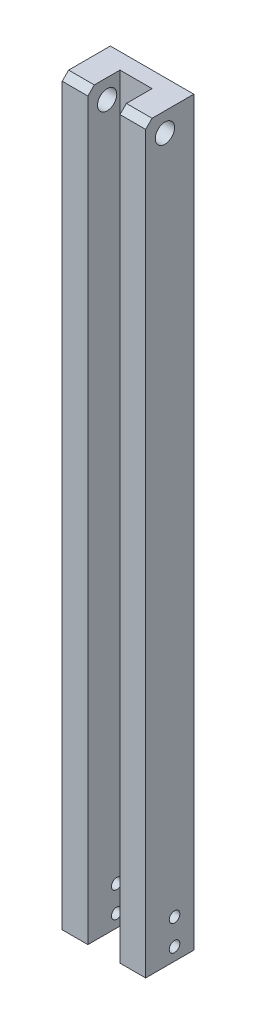
ISO-10303-21;
HEADER;
FILE_DESCRIPTION(('STEP AP214'),'2;1');
FILE_NAME('part.step','',(''),(''),'','','');
FILE_SCHEMA(('AUTOMOTIVE_DESIGN { 1 0 10303 214 1 1 1 1 }'));
ENDSEC;
DATA;
#1=APPLICATION_CONTEXT('core data for automotive mechanical design processes');
#2=APPLICATION_PROTOCOL_DEFINITION('international standard','automotive_design',2000,#1);
#3=PRODUCT_CONTEXT('',#1,'mechanical');
#4=PRODUCT('Part','Part','',(#3));
#5=PRODUCT_RELATED_PRODUCT_CATEGORY('part','',(#4));
#6=PRODUCT_DEFINITION_FORMATION('','',#4);
#7=PRODUCT_DEFINITION_CONTEXT('part definition',#1,'design');
#8=PRODUCT_DEFINITION('design','',#6,#7);
#9=PRODUCT_DEFINITION_SHAPE('','',#8);
#10=(LENGTH_UNIT() NAMED_UNIT(*) SI_UNIT(.MILLI.,.METRE.));
#11=(NAMED_UNIT(*) PLANE_ANGLE_UNIT() SI_UNIT($,.RADIAN.));
#12=(NAMED_UNIT(*) SI_UNIT($,.STERADIAN.) SOLID_ANGLE_UNIT());
#13=UNCERTAINTY_MEASURE_WITH_UNIT(LENGTH_MEASURE(1.E-05),#10,'distance_accuracy_value','');
#14=(GEOMETRIC_REPRESENTATION_CONTEXT(3) GLOBAL_UNCERTAINTY_ASSIGNED_CONTEXT((#13)) GLOBAL_UNIT_ASSIGNED_CONTEXT((#10,
#11,#12)) REPRESENTATION_CONTEXT('',''));
#15=CARTESIAN_POINT('',(0.,0.,0.));
#16=DIRECTION('',(0.,0.,1.));
#17=DIRECTION('',(1.,0.,0.));
#18=AXIS2_PLACEMENT_3D('',#15,#16,#17);
#19=CARTESIAN_POINT('',(0.,-231.,0.));
#20=DIRECTION('',(0.,-1.,0.));
#21=DIRECTION('',(0.,0.,-1.));
#22=AXIS2_PLACEMENT_3D('',#19,#20,#21);
#23=PLANE('',#22);
#24=DIRECTION('',(0.,0.,1.));
#25=VECTOR('',#24,1.);
#26=CARTESIAN_POINT('',(5.,-231.,-2.5));
#27=LINE('',#26,#25);
#28=CARTESIAN_POINT('',(5.,-231.,-7.5));
#29=VERTEX_POINT('',#28);
#30=CARTESIAN_POINT('',(5.,-231.,7.5));
#31=VERTEX_POINT('',#30);
#32=EDGE_CURVE('E216',#29,#31,#27,.T.);
#33=ORIENTED_EDGE('',*,*,#32,.F.);
#34=DIRECTION('',(-1.,0.,0.));
#35=VECTOR('',#34,1.);
#36=CARTESIAN_POINT('',(-13.,-231.,-7.5));
#37=LINE('',#36,#35);
#38=CARTESIAN_POINT('',(13.,-231.,-7.5));
#39=VERTEX_POINT('',#38);
#40=EDGE_CURVE('E226',#39,#29,#37,.T.);
#41=ORIENTED_EDGE('',*,*,#40,.F.);
#42=DIRECTION('',(0.,0.,-1.));
#43=VECTOR('',#42,1.);
#44=CARTESIAN_POINT('',(13.,-231.,7.5));
#45=LINE('',#44,#43);
#46=CARTESIAN_POINT('',(13.,-231.,7.5));
#47=VERTEX_POINT('',#46);
#48=EDGE_CURVE('E190',#47,#39,#45,.T.);
#49=ORIENTED_EDGE('',*,*,#48,.F.);
#50=DIRECTION('',(1.,0.,0.));
#51=VECTOR('',#50,1.);
#52=CARTESIAN_POINT('',(5.,-231.,7.5));
#53=LINE('',#52,#51);
#54=EDGE_CURVE('E167',#31,#47,#53,.T.);
#55=ORIENTED_EDGE('',*,*,#54,.F.);
#56=EDGE_LOOP('',(#33,#41,#49,#55));
#57=FACE_BOUND('',#56,.T.);
#58=ADVANCED_FACE('F37',(#57),#23,.T.);
#59=CARTESIAN_POINT('',(-13.,-219.,-1.5));
#60=DIRECTION('',(-1.,0.,0.));
#61=DIRECTION('',(0.,0.,1.));
#62=AXIS2_PLACEMENT_3D('',#59,#60,#61);
#63=CYLINDRICAL_SURFACE('',#62,1.65);
#64=CARTESIAN_POINT('',(13.,-219.,-1.5));
#65=DIRECTION('',(-1.,0.,0.));
#66=DIRECTION('',(0.,0.,1.));
#67=AXIS2_PLACEMENT_3D('',#64,#65,#66);
#68=CIRCLE('',#67,1.64999999999998);
#69=CARTESIAN_POINT('',(13.,-219.,0.149999999999987));
#70=VERTEX_POINT('',#69);
#71=EDGE_CURVE('E248',#70,#70,#68,.T.);
#72=ORIENTED_EDGE('',*,*,#71,.F.);
#73=EDGE_LOOP('',(#72));
#74=FACE_BOUND('',#73,.T.);
#75=CARTESIAN_POINT('',(5.,-219.,-1.5));
#76=DIRECTION('',(-1.,0.,0.));
#77=DIRECTION('',(0.,0.,1.));
#78=AXIS2_PLACEMENT_3D('',#75,#76,#77);
#79=CIRCLE('',#78,1.65);
#80=CARTESIAN_POINT('',(5.,-219.,0.150000000000001));
#81=VERTEX_POINT('',#80);
#82=EDGE_CURVE('E240',#81,#81,#79,.T.);
#83=ORIENTED_EDGE('',*,*,#82,.T.);
#84=EDGE_LOOP('',(#83));
#85=FACE_BOUND('',#84,.T.);
#86=ADVANCED_FACE('F290',(#74,#85),#63,.F.);
#87=CARTESIAN_POINT('',(-13.,-227.,-1.5));
#88=DIRECTION('',(-1.,0.,0.));
#89=DIRECTION('',(0.,0.,1.));
#90=AXIS2_PLACEMENT_3D('',#87,#88,#89);
#91=CYLINDRICAL_SURFACE('',#90,1.65);
#92=CARTESIAN_POINT('',(13.,-227.,-1.5));
#93=DIRECTION('',(-1.,0.,0.));
#94=DIRECTION('',(0.,0.,1.));
#95=AXIS2_PLACEMENT_3D('',#92,#93,#94);
#96=CIRCLE('',#95,1.64999999999998);
#97=CARTESIAN_POINT('',(13.,-227.,0.149999999999987));
#98=VERTEX_POINT('',#97);
#99=EDGE_CURVE('E260',#98,#98,#96,.T.);
#100=ORIENTED_EDGE('',*,*,#99,.F.);
#101=EDGE_LOOP('',(#100));
#102=FACE_BOUND('',#101,.T.);
#103=CARTESIAN_POINT('',(5.,-227.,-1.5));
#104=DIRECTION('',(-1.,0.,0.));
#105=DIRECTION('',(0.,0.,1.));
#106=AXIS2_PLACEMENT_3D('',#103,#104,#105);
#107=CIRCLE('',#106,1.65);
#108=CARTESIAN_POINT('',(5.,-227.,0.150000000000001));
#109=VERTEX_POINT('',#108);
#110=EDGE_CURVE('E254',#109,#109,#107,.T.);
#111=ORIENTED_EDGE('',*,*,#110,.T.);
#112=EDGE_LOOP('',(#111));
#113=FACE_BOUND('',#112,.T.);
#114=ADVANCED_FACE('F295',(#102,#113),#91,.F.);
#115=CARTESIAN_POINT('',(-5.,-231.,-2.5));
#116=DIRECTION('',(0.,0.,1.));
#117=DIRECTION('',(1.,0.,0.));
#118=AXIS2_PLACEMENT_3D('',#115,#116,#117);
#119=PLANE('',#118);
#120=DIRECTION('',(-1.,0.,0.));
#121=VECTOR('',#120,1.);
#122=CARTESIAN_POINT('',(-5.,-67.45,-2.5));
#123=LINE('',#122,#121);
#124=CARTESIAN_POINT('',(5.,-67.45,-2.5));
#125=VERTEX_POINT('',#124);
#126=CARTESIAN_POINT('',(-5.,-67.45,-2.5));
#127=VERTEX_POINT('',#126);
#128=EDGE_CURVE('E127',#125,#127,#123,.T.);
#129=ORIENTED_EDGE('',*,*,#128,.F.);
#130=DIRECTION('',(0.,1.,0.));
#131=VECTOR('',#130,1.);
#132=CARTESIAN_POINT('',(5.,-231.,-2.5));
#133=LINE('',#132,#131);
#134=CARTESIAN_POINT('',(5.,0.,-2.5));
#135=VERTEX_POINT('',#134);
#136=EDGE_CURVE('E140',#125,#135,#133,.T.);
#137=ORIENTED_EDGE('',*,*,#136,.T.);
#138=DIRECTION('',(1.,0.,0.));
#139=VECTOR('',#138,1.);
#140=CARTESIAN_POINT('',(-5.,0.,-2.5));
#141=LINE('',#140,#139);
#142=CARTESIAN_POINT('',(-5.,0.,-2.5));
#143=VERTEX_POINT('',#142);
#144=EDGE_CURVE('E189',#143,#135,#141,.T.);
#145=ORIENTED_EDGE('',*,*,#144,.F.);
#146=DIRECTION('',(0.,1.,0.));
#147=VECTOR('',#146,1.);
#148=CARTESIAN_POINT('',(-5.,-231.,-2.5));
#149=LINE('',#148,#147);
#150=EDGE_CURVE('E142',#127,#143,#149,.T.);
#151=ORIENTED_EDGE('',*,*,#150,.F.);
#152=EDGE_LOOP('',(#129,#137,#145,#151));
#153=FACE_BOUND('',#152,.T.);
#154=ADVANCED_FACE('F138',(#153),#119,.T.);
#155=CARTESIAN_POINT('',(13.,-231.,7.5));
#156=DIRECTION('',(1.,0.,0.));
#157=DIRECTION('',(0.,0.,-1.));
#158=AXIS2_PLACEMENT_3D('',#155,#156,#157);
#159=PLANE('',#158);
#160=ORIENTED_EDGE('',*,*,#99,.T.);
#161=EDGE_LOOP('',(#160));
#162=FACE_BOUND('',#161,.T.);
#163=ORIENTED_EDGE('',*,*,#71,.T.);
#164=EDGE_LOOP('',(#163));
#165=FACE_BOUND('',#164,.T.);
#166=CARTESIAN_POINT('',(13.,-6.00000000000001,1.5));
#167=DIRECTION('',(1.,0.,0.));
#168=DIRECTION('',(0.,0.,-1.));
#169=AXIS2_PLACEMENT_3D('',#166,#167,#168);
#170=CIRCLE('',#169,3.);
#171=CARTESIAN_POINT('',(13.,-6.00000000000001,-1.5));
#172=VERTEX_POINT('',#171);
#173=EDGE_CURVE('E237',#172,#172,#170,.T.);
#174=ORIENTED_EDGE('',*,*,#173,.F.);
#175=EDGE_LOOP('',(#174));
#176=FACE_BOUND('',#175,.T.);
#177=DIRECTION('',(0.,0.,-1.));
#178=VECTOR('',#177,1.);
#179=CARTESIAN_POINT('',(13.,0.,7.5));
#180=LINE('',#179,#178);
#181=CARTESIAN_POINT('',(13.,0.,5.50000000000002));
#182=VERTEX_POINT('',#181);
#183=CARTESIAN_POINT('',(13.,0.,-7.5));
#184=VERTEX_POINT('',#183);
#185=EDGE_CURVE('E198',#182,#184,#180,.T.);
#186=ORIENTED_EDGE('',*,*,#185,.F.);
#187=DIRECTION('',(0.,-0.707106781186548,0.707106781186548));
#188=VECTOR('',#187,1.);
#189=CARTESIAN_POINT('',(13.,-116.5,122.));
#190=LINE('',#189,#188);
#191=CARTESIAN_POINT('',(13.,-2.,7.5));
#192=VERTEX_POINT('',#191);
#193=EDGE_CURVE('E174',#182,#192,#190,.T.);
#194=ORIENTED_EDGE('',*,*,#193,.T.);
#195=DIRECTION('',(0.,1.,0.));
#196=VECTOR('',#195,1.);
#197=CARTESIAN_POINT('',(13.,-231.,7.5));
#198=LINE('',#197,#196);
#199=EDGE_CURVE('E153',#47,#192,#198,.T.);
#200=ORIENTED_EDGE('',*,*,#199,.F.);
#201=ORIENTED_EDGE('',*,*,#48,.T.);
#202=DIRECTION('',(0.,1.,0.));
#203=VECTOR('',#202,1.);
#204=CARTESIAN_POINT('',(13.,-231.,-7.5));
#205=LINE('',#204,#203);
#206=EDGE_CURVE('E164',#39,#184,#205,.T.);
#207=ORIENTED_EDGE('',*,*,#206,.T.);
#208=EDGE_LOOP('',(#186,#194,#200,#201,#207));
#209=FACE_BOUND('',#208,.T.);
#210=ADVANCED_FACE('F195',(#162,#165,#176,#209),#159,.T.);
#211=CARTESIAN_POINT('',(5.,-231.,7.5));
#212=DIRECTION('',(0.,0.,1.));
#213=DIRECTION('',(1.,0.,0.));
#214=AXIS2_PLACEMENT_3D('',#211,#212,#213);
#215=PLANE('',#214);
#216=ORIENTED_EDGE('',*,*,#199,.T.);
#217=DIRECTION('',(-1.,0.,0.));
#218=VECTOR('',#217,1.);
#219=CARTESIAN_POINT('',(5.,-2.,7.5));
#220=LINE('',#219,#218);
#221=CARTESIAN_POINT('',(5.,-2.00000000000002,7.50000000000002));
#222=VERTEX_POINT('',#221);
#223=EDGE_CURVE('E176',#192,#222,#220,.T.);
#224=ORIENTED_EDGE('',*,*,#223,.T.);
#225=DIRECTION('',(0.,1.,0.));
#226=VECTOR('',#225,1.);
#227=CARTESIAN_POINT('',(5.,-231.,7.5));
#228=LINE('',#227,#226);
#229=EDGE_CURVE('E150',#31,#222,#228,.T.);
#230=ORIENTED_EDGE('',*,*,#229,.F.);
#231=ORIENTED_EDGE('',*,*,#54,.T.);
#232=EDGE_LOOP('',(#216,#224,#230,#231));
#233=FACE_BOUND('',#232,.T.);
#234=ADVANCED_FACE('F201',(#233),#215,.T.);
#235=CARTESIAN_POINT('',(5.,-231.,-2.5));
#236=DIRECTION('',(-1.,0.,0.));
#237=DIRECTION('',(0.,0.,1.));
#238=AXIS2_PLACEMENT_3D('',#235,#236,#237);
#239=PLANE('',#238);
#240=ORIENTED_EDGE('',*,*,#82,.F.);
#241=EDGE_LOOP('',(#240));
#242=FACE_BOUND('',#241,.T.);
#243=ORIENTED_EDGE('',*,*,#136,.F.);
#244=DIRECTION('',(0.,0.,1.));
#245=VECTOR('',#244,1.);
#246=CARTESIAN_POINT('',(5.,-67.45,-7.501));
#247=LINE('',#246,#245);
#248=CARTESIAN_POINT('',(5.,-67.45,-7.5));
#249=VERTEX_POINT('',#248);
#250=EDGE_CURVE('E124',#249,#125,#247,.T.);
#251=ORIENTED_EDGE('',*,*,#250,.F.);
#252=DIRECTION('',(0.,1.,0.));
#253=VECTOR('',#252,1.);
#254=CARTESIAN_POINT('',(5.,-235.452742078331,-7.5));
#255=LINE('',#254,#253);
#256=EDGE_CURVE('E143',#29,#249,#255,.T.);
#257=ORIENTED_EDGE('',*,*,#256,.F.);
#258=ORIENTED_EDGE('',*,*,#32,.T.);
#259=ORIENTED_EDGE('',*,*,#229,.T.);
#260=DIRECTION('',(0.,0.707106781186548,-0.707106781186548));
#261=VECTOR('',#260,1.);
#262=CARTESIAN_POINT('',(5.00000000000001,-111.5,117.));
#263=LINE('',#262,#261);
#264=CARTESIAN_POINT('',(5.,0.,5.50000000000003));
#265=VERTEX_POINT('',#264);
#266=EDGE_CURVE('E178',#222,#265,#263,.T.);
#267=ORIENTED_EDGE('',*,*,#266,.T.);
#268=DIRECTION('',(0.,0.,1.));
#269=VECTOR('',#268,1.);
#270=CARTESIAN_POINT('',(5.,0.,-2.5));
#271=LINE('',#270,#269);
#272=EDGE_CURVE('E148',#135,#265,#271,.T.);
#273=ORIENTED_EDGE('',*,*,#272,.F.);
#274=EDGE_LOOP('',(#243,#251,#257,#258,#259,#267,#273));
#275=FACE_BOUND('',#274,.T.);
#276=ORIENTED_EDGE('',*,*,#110,.F.);
#277=EDGE_LOOP('',(#276));
#278=FACE_BOUND('',#277,.T.);
#279=CARTESIAN_POINT('',(5.,-6.00000000000001,1.5));
#280=DIRECTION('',(-1.,0.,0.));
#281=DIRECTION('',(0.,0.,1.));
#282=AXIS2_PLACEMENT_3D('',#279,#280,#281);
#283=CIRCLE('',#282,3.);
#284=CARTESIAN_POINT('',(4.99999999999999,-6.00000000000001,-1.5));
#285=VERTEX_POINT('',#284);
#286=EDGE_CURVE('E214',#285,#285,#283,.T.);
#287=ORIENTED_EDGE('',*,*,#286,.F.);
#288=EDGE_LOOP('',(#287));
#289=FACE_BOUND('',#288,.T.);
#290=ADVANCED_FACE('F145',(#242,#275,#278,#289),#239,.T.);
#291=CARTESIAN_POINT('',(-5.,-231.,-2.5));
#292=DIRECTION('',(1.,0.,0.));
#293=DIRECTION('',(0.,0.,-1.));
#294=AXIS2_PLACEMENT_3D('',#291,#292,#293);
#295=PLANE('',#294);
#296=CARTESIAN_POINT('',(-5.,-219.,-1.5));
#297=DIRECTION('',(1.,0.,0.));
#298=DIRECTION('',(0.,0.,-1.));
#299=AXIS2_PLACEMENT_3D('',#296,#297,#298);
#300=CIRCLE('',#299,1.65);
#301=CARTESIAN_POINT('',(-5.,-219.,-3.15));
#302=VERTEX_POINT('',#301);
#303=EDGE_CURVE('E245',#302,#302,#300,.T.);
#304=ORIENTED_EDGE('',*,*,#303,.F.);
#305=EDGE_LOOP('',(#304));
#306=FACE_BOUND('',#305,.T.);
#307=DIRECTION('',(0.,0.,1.));
#308=VECTOR('',#307,1.);
#309=CARTESIAN_POINT('',(-5.,-67.45,-7.501));
#310=LINE('',#309,#308);
#311=CARTESIAN_POINT('',(-5.,-67.45,-7.5));
#312=VERTEX_POINT('',#311);
#313=EDGE_CURVE('E135',#312,#127,#310,.T.);
#314=ORIENTED_EDGE('',*,*,#313,.T.);
#315=ORIENTED_EDGE('',*,*,#150,.T.);
#316=DIRECTION('',(0.,0.,-1.));
#317=VECTOR('',#316,1.);
#318=CARTESIAN_POINT('',(-5.,0.,-2.5));
#319=LINE('',#318,#317);
#320=CARTESIAN_POINT('',(-5.,0.,5.50000000000003));
#321=VERTEX_POINT('',#320);
#322=EDGE_CURVE('E205',#321,#143,#319,.T.);
#323=ORIENTED_EDGE('',*,*,#322,.F.);
#324=DIRECTION('',(0.,-0.707106781186548,0.707106781186548));
#325=VECTOR('',#324,1.);
#326=CARTESIAN_POINT('',(-5.,-111.5,117.));
#327=LINE('',#326,#325);
#328=CARTESIAN_POINT('',(-5.,-2.,7.5));
#329=VERTEX_POINT('',#328);
#330=EDGE_CURVE('E59',#321,#329,#327,.T.);
#331=ORIENTED_EDGE('',*,*,#330,.T.);
#332=DIRECTION('',(0.,1.,0.));
#333=VECTOR('',#332,1.);
#334=CARTESIAN_POINT('',(-5.,-231.,7.5));
#335=LINE('',#334,#333);
#336=CARTESIAN_POINT('',(-5.,-231.,7.5));
#337=VERTEX_POINT('',#336);
#338=EDGE_CURVE('E155',#337,#329,#335,.T.);
#339=ORIENTED_EDGE('',*,*,#338,.F.);
#340=DIRECTION('',(0.,0.,-1.));
#341=VECTOR('',#340,1.);
#342=CARTESIAN_POINT('',(-5.,-231.,-2.5));
#343=LINE('',#342,#341);
#344=CARTESIAN_POINT('',(-5.,-231.,-7.5));
#345=VERTEX_POINT('',#344);
#346=EDGE_CURVE('E218',#337,#345,#343,.T.);
#347=ORIENTED_EDGE('',*,*,#346,.T.);
#348=DIRECTION('',(0.,-1.,0.));
#349=VECTOR('',#348,1.);
#350=CARTESIAN_POINT('',(-5.,-235.452742078331,-7.5));
#351=LINE('',#350,#349);
#352=EDGE_CURVE('E269',#312,#345,#351,.T.);
#353=ORIENTED_EDGE('',*,*,#352,.F.);
#354=EDGE_LOOP('',(#314,#315,#323,#331,#339,#347,#353));
#355=FACE_BOUND('',#354,.T.);
#356=CARTESIAN_POINT('',(-5.,-227.,-1.5));
#357=DIRECTION('',(1.,0.,0.));
#358=DIRECTION('',(0.,0.,-1.));
#359=AXIS2_PLACEMENT_3D('',#356,#357,#358);
#360=CIRCLE('',#359,1.65);
#361=CARTESIAN_POINT('',(-5.,-227.,-3.15));
#362=VERTEX_POINT('',#361);
#363=EDGE_CURVE('E257',#362,#362,#360,.T.);
#364=ORIENTED_EDGE('',*,*,#363,.F.);
#365=EDGE_LOOP('',(#364));
#366=FACE_BOUND('',#365,.T.);
#367=CARTESIAN_POINT('',(-5.,-6.00000000000001,1.5));
#368=DIRECTION('',(1.,0.,0.));
#369=DIRECTION('',(0.,0.,-1.));
#370=AXIS2_PLACEMENT_3D('',#367,#368,#369);
#371=CIRCLE('',#370,3.);
#372=CARTESIAN_POINT('',(-5.,-6.00000000000001,-1.5));
#373=VERTEX_POINT('',#372);
#374=EDGE_CURVE('E233',#373,#373,#371,.T.);
#375=ORIENTED_EDGE('',*,*,#374,.F.);
#376=EDGE_LOOP('',(#375));
#377=FACE_BOUND('',#376,.T.);
#378=ADVANCED_FACE('F345',(#306,#355,#366,#377),#295,.T.);
#379=CARTESIAN_POINT('',(-13.,-231.,7.5));
#380=DIRECTION('',(0.,0.,1.));
#381=DIRECTION('',(1.,0.,0.));
#382=AXIS2_PLACEMENT_3D('',#379,#380,#381);
#383=PLANE('',#382);
#384=ORIENTED_EDGE('',*,*,#338,.T.);
#385=DIRECTION('',(-1.,0.,0.));
#386=VECTOR('',#385,1.);
#387=CARTESIAN_POINT('',(-13.,-2.,7.5));
#388=LINE('',#387,#386);
#389=CARTESIAN_POINT('',(-13.,-2.,7.5));
#390=VERTEX_POINT('',#389);
#391=EDGE_CURVE('E45',#329,#390,#388,.T.);
#392=ORIENTED_EDGE('',*,*,#391,.T.);
#393=DIRECTION('',(0.,1.,0.));
#394=VECTOR('',#393,1.);
#395=CARTESIAN_POINT('',(-13.,-231.,7.5));
#396=LINE('',#395,#394);
#397=CARTESIAN_POINT('',(-13.,-231.,7.5));
#398=VERTEX_POINT('',#397);
#399=EDGE_CURVE('E160',#398,#390,#396,.T.);
#400=ORIENTED_EDGE('',*,*,#399,.F.);
#401=DIRECTION('',(1.,0.,0.));
#402=VECTOR('',#401,1.);
#403=CARTESIAN_POINT('',(-13.,-231.,7.5));
#404=LINE('',#403,#402);
#405=EDGE_CURVE('E220',#398,#337,#404,.T.);
#406=ORIENTED_EDGE('',*,*,#405,.T.);
#407=EDGE_LOOP('',(#384,#392,#400,#406));
#408=FACE_BOUND('',#407,.T.);
#409=ADVANCED_FACE('F311',(#408),#383,.T.);
#410=CARTESIAN_POINT('',(-13.,-231.,7.5));
#411=DIRECTION('',(-1.,0.,0.));
#412=DIRECTION('',(0.,0.,1.));
#413=AXIS2_PLACEMENT_3D('',#410,#411,#412);
#414=PLANE('',#413);
#415=CARTESIAN_POINT('',(-13.,-227.,-1.5));
#416=DIRECTION('',(-1.,0.,0.));
#417=DIRECTION('',(0.,0.,1.));
#418=AXIS2_PLACEMENT_3D('',#415,#416,#417);
#419=CIRCLE('',#418,1.65000000000001);
#420=CARTESIAN_POINT('',(-13.,-227.,0.150000000000015));
#421=VERTEX_POINT('',#420);
#422=EDGE_CURVE('E263',#421,#421,#419,.T.);
#423=ORIENTED_EDGE('',*,*,#422,.F.);
#424=EDGE_LOOP('',(#423));
#425=FACE_BOUND('',#424,.T.);
#426=CARTESIAN_POINT('',(-13.,-219.,-1.5));
#427=DIRECTION('',(-1.,0.,0.));
#428=DIRECTION('',(0.,0.,1.));
#429=AXIS2_PLACEMENT_3D('',#426,#427,#428);
#430=CIRCLE('',#429,1.65000000000001);
#431=CARTESIAN_POINT('',(-13.,-219.,0.150000000000015));
#432=VERTEX_POINT('',#431);
#433=EDGE_CURVE('E251',#432,#432,#430,.T.);
#434=ORIENTED_EDGE('',*,*,#433,.F.);
#435=EDGE_LOOP('',(#434));
#436=FACE_BOUND('',#435,.T.);
#437=CARTESIAN_POINT('',(-13.,-6.00000000000001,1.5));
#438=DIRECTION('',(1.,0.,0.));
#439=DIRECTION('',(0.,0.,-1.));
#440=AXIS2_PLACEMENT_3D('',#437,#438,#439);
#441=CIRCLE('',#440,3.);
#442=CARTESIAN_POINT('',(-13.,-6.00000000000001,-1.5));
#443=VERTEX_POINT('',#442);
#444=EDGE_CURVE('E236',#443,#443,#441,.T.);
#445=ORIENTED_EDGE('',*,*,#444,.T.);
#446=EDGE_LOOP('',(#445));
#447=FACE_BOUND('',#446,.T.);
#448=ORIENTED_EDGE('',*,*,#399,.T.);
#449=DIRECTION('',(0.,0.707106781186548,-0.707106781186548));
#450=VECTOR('',#449,1.);
#451=CARTESIAN_POINT('',(-13.,-116.5,122.));
#452=LINE('',#451,#450);
#453=CARTESIAN_POINT('',(-13.,0.,5.50000000000002));
#454=VERTEX_POINT('',#453);
#455=EDGE_CURVE('E11',#390,#454,#452,.T.);
#456=ORIENTED_EDGE('',*,*,#455,.T.);
#457=DIRECTION('',(0.,0.,1.));
#458=VECTOR('',#457,1.);
#459=CARTESIAN_POINT('',(-13.,0.,7.5));
#460=LINE('',#459,#458);
#461=CARTESIAN_POINT('',(-13.,0.,-7.5));
#462=VERTEX_POINT('',#461);
#463=EDGE_CURVE('E207',#462,#454,#460,.T.);
#464=ORIENTED_EDGE('',*,*,#463,.F.);
#465=DIRECTION('',(0.,1.,0.));
#466=VECTOR('',#465,1.);
#467=CARTESIAN_POINT('',(-13.,-231.,-7.5));
#468=LINE('',#467,#466);
#469=CARTESIAN_POINT('',(-13.,-231.,-7.5));
#470=VERTEX_POINT('',#469);
#471=EDGE_CURVE('E162',#470,#462,#468,.T.);
#472=ORIENTED_EDGE('',*,*,#471,.F.);
#473=DIRECTION('',(0.,0.,1.));
#474=VECTOR('',#473,1.);
#475=CARTESIAN_POINT('',(-13.,-231.,7.5));
#476=LINE('',#475,#474);
#477=EDGE_CURVE('E223',#470,#398,#476,.T.);
#478=ORIENTED_EDGE('',*,*,#477,.T.);
#479=EDGE_LOOP('',(#448,#456,#464,#472,#478));
#480=FACE_BOUND('',#479,.T.);
#481=ADVANCED_FACE('F282',(#425,#436,#447,#480),#414,.T.);
#482=CARTESIAN_POINT('',(-13.,-231.,-7.5));
#483=DIRECTION('',(0.,0.,-1.));
#484=DIRECTION('',(-1.,0.,0.));
#485=AXIS2_PLACEMENT_3D('',#482,#483,#484);
#486=PLANE('',#485);
#487=ORIENTED_EDGE('',*,*,#256,.T.);
#488=DIRECTION('',(-1.,0.,0.));
#489=VECTOR('',#488,1.);
#490=CARTESIAN_POINT('',(-5.,-67.45,-7.5));
#491=LINE('',#490,#489);
#492=EDGE_CURVE('E130',#249,#312,#491,.T.);
#493=ORIENTED_EDGE('',*,*,#492,.T.);
#494=ORIENTED_EDGE('',*,*,#352,.T.);
#495=EDGE_CURVE('E229',#345,#470,#37,.T.);
#496=ORIENTED_EDGE('',*,*,#495,.T.);
#497=ORIENTED_EDGE('',*,*,#471,.T.);
#498=DIRECTION('',(-1.,0.,0.));
#499=VECTOR('',#498,1.);
#500=CARTESIAN_POINT('',(-13.,0.,-7.5));
#501=LINE('',#500,#499);
#502=EDGE_CURVE('E210',#184,#462,#501,.T.);
#503=ORIENTED_EDGE('',*,*,#502,.F.);
#504=ORIENTED_EDGE('',*,*,#206,.F.);
#505=ORIENTED_EDGE('',*,*,#40,.T.);
#506=EDGE_LOOP('',(#487,#493,#494,#496,#497,#503,#504,#505));
#507=FACE_BOUND('',#506,.T.);
#508=ADVANCED_FACE('F274',(#507),#486,.T.);
#509=ORIENTED_EDGE('',*,*,#495,.F.);
#510=ORIENTED_EDGE('',*,*,#346,.F.);
#511=ORIENTED_EDGE('',*,*,#405,.F.);
#512=ORIENTED_EDGE('',*,*,#477,.F.);
#513=EDGE_LOOP('',(#509,#510,#511,#512));
#514=FACE_BOUND('',#513,.T.);
#515=ADVANCED_FACE('F279',(#514),#23,.T.);
#516=CARTESIAN_POINT('',(0.,0.,0.));
#517=DIRECTION('',(0.,-1.,0.));
#518=DIRECTION('',(0.,0.,-1.));
#519=AXIS2_PLACEMENT_3D('',#516,#517,#518);
#520=PLANE('',#519);
#521=ORIENTED_EDGE('',*,*,#272,.T.);
#522=DIRECTION('',(1.,0.,0.));
#523=VECTOR('',#522,1.);
#524=CARTESIAN_POINT('',(13.,0.,5.5));
#525=LINE('',#524,#523);
#526=EDGE_CURVE('E171',#265,#182,#525,.T.);
#527=ORIENTED_EDGE('',*,*,#526,.T.);
#528=ORIENTED_EDGE('',*,*,#185,.T.);
#529=ORIENTED_EDGE('',*,*,#502,.T.);
#530=ORIENTED_EDGE('',*,*,#463,.T.);
#531=DIRECTION('',(1.,0.,0.));
#532=VECTOR('',#531,1.);
#533=CARTESIAN_POINT('',(-5.,0.,5.5));
#534=LINE('',#533,#532);
#535=EDGE_CURVE('E168',#454,#321,#534,.T.);
#536=ORIENTED_EDGE('',*,*,#535,.T.);
#537=ORIENTED_EDGE('',*,*,#322,.T.);
#538=ORIENTED_EDGE('',*,*,#144,.T.);
#539=EDGE_LOOP('',(#521,#527,#528,#529,#530,#536,#537,#538));
#540=FACE_BOUND('',#539,.T.);
#541=ADVANCED_FACE('F186',(#540),#520,.F.);
#542=CARTESIAN_POINT('',(-13.,-6.00000000000001,1.5));
#543=DIRECTION('',(1.,0.,0.));
#544=DIRECTION('',(0.,0.,-1.));
#545=AXIS2_PLACEMENT_3D('',#542,#543,#544);
#546=CYLINDRICAL_SURFACE('',#545,3.);
#547=CARTESIAN_POINT('',(-5.,-6.00000000000001,-1.5));
#548=CARTESIAN_POINT('',(-5.08333333333334,-6.00000000000001,-1.5));
#549=CARTESIAN_POINT('',(-5.16666666666667,-6.00000000000001,-1.5));
#550=CARTESIAN_POINT('',(-5.33333333333334,-6.00000000000001,-1.5));
#551=CARTESIAN_POINT('',(-5.41666666666667,-6.00000000000001,-1.5));
#552=CARTESIAN_POINT('',(-5.58333333333334,-6.00000000000001,-1.5));
#553=CARTESIAN_POINT('',(-5.66666666666667,-6.00000000000001,-1.5));
#554=CARTESIAN_POINT('',(-5.83333333333334,-6.00000000000001,-1.5));
#555=CARTESIAN_POINT('',(-5.91666666666667,-6.00000000000001,-1.5));
#556=CARTESIAN_POINT('',(-6.08333333333334,-6.00000000000001,-1.5));
#557=CARTESIAN_POINT('',(-6.16666666666667,-6.00000000000001,-1.5));
#558=CARTESIAN_POINT('',(-6.33333333333334,-6.00000000000001,-1.5));
#559=CARTESIAN_POINT('',(-6.41666666666667,-6.00000000000001,-1.5));
#560=CARTESIAN_POINT('',(-6.58333333333334,-6.00000000000001,-1.5));
#561=CARTESIAN_POINT('',(-6.66666666666667,-6.00000000000001,-1.5));
#562=CARTESIAN_POINT('',(-6.83333333333334,-6.00000000000001,-1.5));
#563=CARTESIAN_POINT('',(-6.91666666666667,-6.00000000000001,-1.5));
#564=CARTESIAN_POINT('',(-7.08333333333334,-6.00000000000001,-1.5));
#565=CARTESIAN_POINT('',(-7.16666666666667,-6.00000000000001,-1.5));
#566=CARTESIAN_POINT('',(-7.33333333333334,-6.00000000000001,-1.5));
#567=CARTESIAN_POINT('',(-7.41666666666667,-6.00000000000001,-1.5));
#568=CARTESIAN_POINT('',(-7.58333333333334,-6.00000000000001,-1.5));
#569=CARTESIAN_POINT('',(-7.66666666666667,-6.00000000000001,-1.5));
#570=CARTESIAN_POINT('',(-7.83333333333334,-6.00000000000001,-1.5));
#571=CARTESIAN_POINT('',(-7.91666666666667,-6.00000000000001,-1.5));
#572=CARTESIAN_POINT('',(-8.08333333333334,-6.00000000000001,-1.5));
#573=CARTESIAN_POINT('',(-8.16666666666667,-6.00000000000001,-1.5));
#574=CARTESIAN_POINT('',(-8.33333333333334,-6.00000000000001,-1.5));
#575=CARTESIAN_POINT('',(-8.41666666666667,-6.00000000000001,-1.5));
#576=CARTESIAN_POINT('',(-8.58333333333334,-6.00000000000001,-1.5));
#577=CARTESIAN_POINT('',(-8.66666666666667,-6.00000000000001,-1.5));
#578=CARTESIAN_POINT('',(-8.83333333333334,-6.00000000000001,-1.5));
#579=CARTESIAN_POINT('',(-8.91666666666667,-6.00000000000001,-1.5));
#580=CARTESIAN_POINT('',(-9.08333333333334,-6.00000000000001,-1.5));
#581=CARTESIAN_POINT('',(-9.16666666666667,-6.00000000000001,-1.5));
#582=CARTESIAN_POINT('',(-9.33333333333334,-6.00000000000001,-1.5));
#583=CARTESIAN_POINT('',(-9.41666666666667,-6.00000000000001,-1.5));
#584=CARTESIAN_POINT('',(-9.58333333333334,-6.00000000000001,-1.5));
#585=CARTESIAN_POINT('',(-9.66666666666667,-6.00000000000001,-1.5));
#586=CARTESIAN_POINT('',(-9.83333333333334,-6.00000000000001,-1.5));
#587=CARTESIAN_POINT('',(-9.91666666666667,-6.00000000000001,-1.5));
#588=CARTESIAN_POINT('',(-10.0833333333333,-6.00000000000001,-1.5));
#589=CARTESIAN_POINT('',(-10.1666666666667,-6.00000000000001,-1.5));
#590=CARTESIAN_POINT('',(-10.3333333333333,-6.00000000000001,-1.5));
#591=CARTESIAN_POINT('',(-10.4166666666667,-6.00000000000001,-1.5));
#592=CARTESIAN_POINT('',(-10.5833333333333,-6.00000000000001,-1.5));
#593=CARTESIAN_POINT('',(-10.6666666666667,-6.00000000000001,-1.5));
#594=CARTESIAN_POINT('',(-10.8333333333333,-6.00000000000001,-1.5));
#595=CARTESIAN_POINT('',(-10.9166666666667,-6.00000000000001,-1.5));
#596=CARTESIAN_POINT('',(-11.0833333333333,-6.00000000000001,-1.5));
#597=CARTESIAN_POINT('',(-11.1666666666667,-6.00000000000001,-1.5));
#598=CARTESIAN_POINT('',(-11.3333333333333,-6.00000000000001,-1.5));
#599=CARTESIAN_POINT('',(-11.4166666666667,-6.00000000000001,-1.5));
#600=CARTESIAN_POINT('',(-11.5833333333333,-6.00000000000001,-1.5));
#601=CARTESIAN_POINT('',(-11.6666666666667,-6.00000000000001,-1.5));
#602=CARTESIAN_POINT('',(-11.8333333333333,-6.00000000000001,-1.5));
#603=CARTESIAN_POINT('',(-11.9166666666667,-6.00000000000001,-1.5));
#604=CARTESIAN_POINT('',(-12.0833333333333,-6.00000000000001,-1.5));
#605=CARTESIAN_POINT('',(-12.1666666666667,-6.00000000000001,-1.5));
#606=CARTESIAN_POINT('',(-12.3333333333333,-6.00000000000001,-1.5));
#607=CARTESIAN_POINT('',(-12.4166666666667,-6.00000000000001,-1.5));
#608=CARTESIAN_POINT('',(-12.5833333333333,-6.00000000000001,-1.5));
#609=CARTESIAN_POINT('',(-12.6666666666667,-6.00000000000001,-1.5));
#610=CARTESIAN_POINT('',(-12.8333333333333,-6.00000000000001,-1.5));
#611=CARTESIAN_POINT('',(-12.9166666666667,-6.00000000000001,-1.5));
#612=CARTESIAN_POINT('',(-13.,-6.00000000000001,-1.5));
#613=B_SPLINE_CURVE_WITH_KNOTS('',3,(#547,#548,#549,#550,#551,#552,#553,#554,#555,#556,#557,
#558,#559,#560,#561,#562,#563,#564,#565,#566,#567,#568,#569,#570,#571,#572,#573,#574,#575,#576,
#577,#578,#579,#580,#581,#582,#583,#584,#585,#586,#587,#588,#589,#590,#591,#592,#593,#594,#595,
#596,#597,#598,#599,#600,#601,#602,#603,#604,#605,#606,#607,#608,#609,#610,#611,#612),
.UNSPECIFIED.,.F.,.F.,(4,2,2,2,2,2,2,2,2,2,2,2,2,2,2,2,2,2,2,2,2,2,2,2,2,2,2,2,2,2,2,2,4),(0.,
0.249999999999999,0.5,0.75,1.,1.25,1.5,1.75,2.,2.25,2.5,2.75,3.,3.25,3.5,3.75,4.,4.25,4.5,4.75,
5.,5.25,5.5,5.75,6.,6.25,6.5,6.75,7.,7.25,7.5,7.75,8.),.UNSPECIFIED.);
#614=EDGE_CURVE('BSEAM306',#373,#443,#613,.T.);
#615=ORIENTED_EDGE('',*,*,#374,.T.);
#616=ORIENTED_EDGE('',*,*,#444,.F.);
#617=ORIENTED_EDGE('',*,*,#614,.T.);
#618=ORIENTED_EDGE('',*,*,#614,.F.);
#619=EDGE_LOOP('',(#615,#617,#616,#618));
#620=FACE_BOUND('',#619,.T.);
#621=ADVANCED_FACE('F306',(#620),#546,.F.);
#622=CARTESIAN_POINT('',(4.99999999999999,-6.00000000000001,-1.5));
#623=CARTESIAN_POINT('',(5.08333333333333,-6.00000000000001,-1.5));
#624=CARTESIAN_POINT('',(5.16666666666666,-6.00000000000001,-1.5));
#625=CARTESIAN_POINT('',(5.33333333333333,-6.00000000000001,-1.5));
#626=CARTESIAN_POINT('',(5.41666666666666,-6.00000000000001,-1.5));
#627=CARTESIAN_POINT('',(5.58333333333333,-6.00000000000001,-1.5));
#628=CARTESIAN_POINT('',(5.66666666666666,-6.00000000000001,-1.5));
#629=CARTESIAN_POINT('',(5.83333333333333,-6.00000000000001,-1.5));
#630=CARTESIAN_POINT('',(5.91666666666666,-6.00000000000001,-1.5));
#631=CARTESIAN_POINT('',(6.08333333333333,-6.00000000000001,-1.5));
#632=CARTESIAN_POINT('',(6.16666666666666,-6.00000000000001,-1.5));
#633=CARTESIAN_POINT('',(6.33333333333333,-6.00000000000001,-1.5));
#634=CARTESIAN_POINT('',(6.41666666666666,-6.00000000000001,-1.5));
#635=CARTESIAN_POINT('',(6.58333333333333,-6.00000000000001,-1.5));
#636=CARTESIAN_POINT('',(6.66666666666666,-6.00000000000001,-1.5));
#637=CARTESIAN_POINT('',(6.83333333333333,-6.00000000000001,-1.5));
#638=CARTESIAN_POINT('',(6.91666666666666,-6.00000000000001,-1.5));
#639=CARTESIAN_POINT('',(7.08333333333333,-6.00000000000001,-1.5));
#640=CARTESIAN_POINT('',(7.16666666666666,-6.00000000000001,-1.5));
#641=CARTESIAN_POINT('',(7.33333333333333,-6.00000000000001,-1.5));
#642=CARTESIAN_POINT('',(7.41666666666666,-6.00000000000001,-1.5));
#643=CARTESIAN_POINT('',(7.58333333333333,-6.00000000000001,-1.5));
#644=CARTESIAN_POINT('',(7.66666666666666,-6.00000000000001,-1.5));
#645=CARTESIAN_POINT('',(7.83333333333333,-6.00000000000001,-1.5));
#646=CARTESIAN_POINT('',(7.91666666666666,-6.00000000000001,-1.5));
#647=CARTESIAN_POINT('',(8.08333333333333,-6.00000000000001,-1.5));
#648=CARTESIAN_POINT('',(8.16666666666666,-6.00000000000001,-1.5));
#649=CARTESIAN_POINT('',(8.33333333333333,-6.00000000000001,-1.5));
#650=CARTESIAN_POINT('',(8.41666666666666,-6.00000000000001,-1.5));
#651=CARTESIAN_POINT('',(8.58333333333333,-6.00000000000001,-1.5));
#652=CARTESIAN_POINT('',(8.66666666666666,-6.00000000000001,-1.5));
#653=CARTESIAN_POINT('',(8.83333333333333,-6.00000000000001,-1.5));
#654=CARTESIAN_POINT('',(8.91666666666666,-6.00000000000001,-1.5));
#655=CARTESIAN_POINT('',(9.08333333333333,-6.00000000000001,-1.5));
#656=CARTESIAN_POINT('',(9.16666666666666,-6.00000000000001,-1.5));
#657=CARTESIAN_POINT('',(9.33333333333333,-6.00000000000001,-1.5));
#658=CARTESIAN_POINT('',(9.41666666666666,-6.00000000000001,-1.5));
#659=CARTESIAN_POINT('',(9.58333333333333,-6.00000000000001,-1.5));
#660=CARTESIAN_POINT('',(9.66666666666666,-6.00000000000001,-1.5));
#661=CARTESIAN_POINT('',(9.83333333333333,-6.00000000000001,-1.5));
#662=CARTESIAN_POINT('',(9.91666666666666,-6.00000000000001,-1.5));
#663=CARTESIAN_POINT('',(10.0833333333333,-6.00000000000001,-1.5));
#664=CARTESIAN_POINT('',(10.1666666666667,-6.00000000000001,-1.5));
#665=CARTESIAN_POINT('',(10.3333333333333,-6.00000000000001,-1.5));
#666=CARTESIAN_POINT('',(10.4166666666667,-6.00000000000001,-1.5));
#667=CARTESIAN_POINT('',(10.5833333333333,-6.00000000000001,-1.5));
#668=CARTESIAN_POINT('',(10.6666666666667,-6.00000000000001,-1.5));
#669=CARTESIAN_POINT('',(10.8333333333333,-6.00000000000001,-1.5));
#670=CARTESIAN_POINT('',(10.9166666666667,-6.00000000000001,-1.5));
#671=CARTESIAN_POINT('',(11.0833333333333,-6.00000000000001,-1.5));
#672=CARTESIAN_POINT('',(11.1666666666667,-6.00000000000001,-1.5));
#673=CARTESIAN_POINT('',(11.3333333333333,-6.00000000000001,-1.5));
#674=CARTESIAN_POINT('',(11.4166666666667,-6.00000000000001,-1.5));
#675=CARTESIAN_POINT('',(11.5833333333333,-6.00000000000001,-1.5));
#676=CARTESIAN_POINT('',(11.6666666666667,-6.00000000000001,-1.5));
#677=CARTESIAN_POINT('',(11.8333333333333,-6.00000000000001,-1.5));
#678=CARTESIAN_POINT('',(11.9166666666667,-6.00000000000001,-1.5));
#679=CARTESIAN_POINT('',(12.0833333333333,-6.00000000000001,-1.5));
#680=CARTESIAN_POINT('',(12.1666666666667,-6.00000000000001,-1.5));
#681=CARTESIAN_POINT('',(12.3333333333333,-6.00000000000001,-1.5));
#682=CARTESIAN_POINT('',(12.4166666666667,-6.00000000000001,-1.5));
#683=CARTESIAN_POINT('',(12.5833333333333,-6.00000000000001,-1.5));
#684=CARTESIAN_POINT('',(12.6666666666667,-6.00000000000001,-1.5));
#685=CARTESIAN_POINT('',(12.8333333333333,-6.00000000000001,-1.5));
#686=CARTESIAN_POINT('',(12.9166666666667,-6.00000000000001,-1.5));
#687=CARTESIAN_POINT('',(13.,-6.00000000000001,-1.5));
#688=B_SPLINE_CURVE_WITH_KNOTS('',3,(#622,#623,#624,#625,#626,#627,#628,#629,#630,#631,#632,
#633,#634,#635,#636,#637,#638,#639,#640,#641,#642,#643,#644,#645,#646,#647,#648,#649,#650,#651,
#652,#653,#654,#655,#656,#657,#658,#659,#660,#661,#662,#663,#664,#665,#666,#667,#668,#669,#670,
#671,#672,#673,#674,#675,#676,#677,#678,#679,#680,#681,#682,#683,#684,#685,#686,#687),
.UNSPECIFIED.,.F.,.F.,(4,2,2,2,2,2,2,2,2,2,2,2,2,2,2,2,2,2,2,2,2,2,2,2,2,2,2,2,2,2,2,2,4),(0.,
0.25,0.5,0.750000000000001,1.,1.25,1.5,1.75,2.,2.25,2.5,2.75,3.,3.25,3.5,3.75,4.,4.25,4.5,4.75,
5.,5.25,5.5,5.75,6.,6.25,6.5,6.75,7.,7.25,7.5,7.75,8.),.UNSPECIFIED.);
#689=EDGE_CURVE('BSEAM330',#285,#172,#688,.T.);
#690=ORIENTED_EDGE('',*,*,#286,.T.);
#691=ORIENTED_EDGE('',*,*,#173,.T.);
#692=ORIENTED_EDGE('',*,*,#689,.T.);
#693=ORIENTED_EDGE('',*,*,#689,.F.);
#694=EDGE_LOOP('',(#690,#692,#691,#693));
#695=FACE_BOUND('',#694,.T.);
#696=ADVANCED_FACE('F330',(#695),#546,.F.);
#697=ORIENTED_EDGE('',*,*,#303,.T.);
#698=EDGE_LOOP('',(#697));
#699=FACE_BOUND('',#698,.T.);
#700=ORIENTED_EDGE('',*,*,#433,.T.);
#701=EDGE_LOOP('',(#700));
#702=FACE_BOUND('',#701,.T.);
#703=ADVANCED_FACE('F298',(#699,#702),#63,.F.);
#704=ORIENTED_EDGE('',*,*,#363,.T.);
#705=EDGE_LOOP('',(#704));
#706=FACE_BOUND('',#705,.T.);
#707=ORIENTED_EDGE('',*,*,#422,.T.);
#708=EDGE_LOOP('',(#707));
#709=FACE_BOUND('',#708,.T.);
#710=ADVANCED_FACE('F319',(#706,#709),#91,.F.);
#711=CARTESIAN_POINT('',(0.,0.,5.5));
#712=DIRECTION('',(0.,0.707106781186547,0.707106781186547));
#713=DIRECTION('',(-1.,0.,0.));
#714=AXIS2_PLACEMENT_3D('',#711,#712,#713);
#715=PLANE('',#714);
#716=ORIENTED_EDGE('',*,*,#266,.F.);
#717=ORIENTED_EDGE('',*,*,#223,.F.);
#718=ORIENTED_EDGE('',*,*,#193,.F.);
#719=ORIENTED_EDGE('',*,*,#526,.F.);
#720=EDGE_LOOP('',(#716,#717,#718,#719));
#721=FACE_BOUND('',#720,.T.);
#722=ADVANCED_FACE('F192',(#721),#715,.T.);
#723=CARTESIAN_POINT('',(0.,0.,5.5));
#724=DIRECTION('',(0.,0.707106781186547,0.707106781186547));
#725=DIRECTION('',(-1.,0.,0.));
#726=AXIS2_PLACEMENT_3D('',#723,#724,#725);
#727=PLANE('',#726);
#728=ORIENTED_EDGE('',*,*,#455,.F.);
#729=ORIENTED_EDGE('',*,*,#391,.F.);
#730=ORIENTED_EDGE('',*,*,#330,.F.);
#731=ORIENTED_EDGE('',*,*,#535,.F.);
#732=EDGE_LOOP('',(#728,#729,#730,#731));
#733=FACE_BOUND('',#732,.T.);
#734=ADVANCED_FACE('F39',(#733),#727,.T.);
#735=CARTESIAN_POINT('',(-5.,-67.45,-7.501));
#736=DIRECTION('',(0.,1.,0.));
#737=DIRECTION('',(0.,0.,1.));
#738=AXIS2_PLACEMENT_3D('',#735,#736,#737);
#739=PLANE('',#738);
#740=ORIENTED_EDGE('',*,*,#250,.T.);
#741=ORIENTED_EDGE('',*,*,#128,.T.);
#742=ORIENTED_EDGE('',*,*,#313,.F.);
#743=ORIENTED_EDGE('',*,*,#492,.F.);
#744=EDGE_LOOP('',(#740,#741,#742,#743));
#745=FACE_BOUND('',#744,.T.);
#746=ADVANCED_FACE('F126',(#745),#739,.F.);
#747=CLOSED_SHELL('',(#58,#86,#114,#154,#210,#234,#290,#378,#409,#481,#508,#515,#541,#621,#696,
#703,#710,#722,#734,#746));
#748=MANIFOLD_SOLID_BREP('B2',#747);
#749=ADVANCED_BREP_SHAPE_REPRESENTATION('',(#18,#748),#14);
#750=SHAPE_DEFINITION_REPRESENTATION(#9,#749);
ENDSEC;
END-ISO-10303-21;
